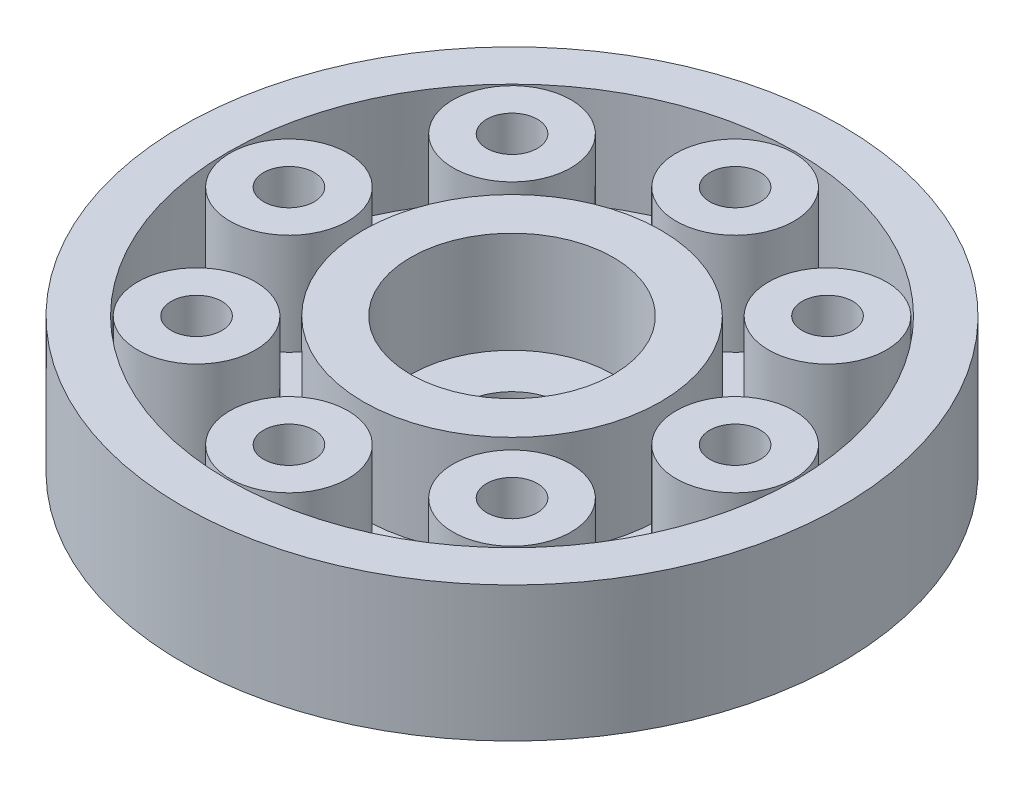
ISO-10303-21;
HEADER;
FILE_DESCRIPTION(('STEP AP214'),'2;1');
FILE_NAME('part.step','',(''),(''),'','','');
FILE_SCHEMA(('AUTOMOTIVE_DESIGN { 1 0 10303 214 1 1 1 1 }'));
ENDSEC;
DATA;
#1=APPLICATION_CONTEXT('core data for automotive mechanical design processes');
#2=APPLICATION_PROTOCOL_DEFINITION('international standard','automotive_design',2000,#1);
#3=PRODUCT_CONTEXT('',#1,'mechanical');
#4=PRODUCT('Part','Part','',(#3));
#5=PRODUCT_RELATED_PRODUCT_CATEGORY('part','',(#4));
#6=PRODUCT_DEFINITION_FORMATION('','',#4);
#7=PRODUCT_DEFINITION_CONTEXT('part definition',#1,'design');
#8=PRODUCT_DEFINITION('design','',#6,#7);
#9=PRODUCT_DEFINITION_SHAPE('','',#8);
#10=(LENGTH_UNIT() NAMED_UNIT(*) SI_UNIT(.MILLI.,.METRE.));
#11=(NAMED_UNIT(*) PLANE_ANGLE_UNIT() SI_UNIT($,.RADIAN.));
#12=(NAMED_UNIT(*) SI_UNIT($,.STERADIAN.) SOLID_ANGLE_UNIT());
#13=UNCERTAINTY_MEASURE_WITH_UNIT(LENGTH_MEASURE(1.E-05),#10,'distance_accuracy_value','');
#14=(GEOMETRIC_REPRESENTATION_CONTEXT(3) GLOBAL_UNCERTAINTY_ASSIGNED_CONTEXT((#13)) GLOBAL_UNIT_ASSIGNED_CONTEXT((#10,
#11,#12)) REPRESENTATION_CONTEXT('',''));
#15=CARTESIAN_POINT('',(0.,0.,0.));
#16=DIRECTION('',(0.,0.,1.));
#17=DIRECTION('',(1.,0.,0.));
#18=AXIS2_PLACEMENT_3D('',#15,#16,#17);
#19=CARTESIAN_POINT('',(0.394660743405106,3.,0.591991115107673));
#20=DIRECTION('',(0.,1.,0.));
#21=DIRECTION('',(0.,0.,1.));
#22=AXIS2_PLACEMENT_3D('',#19,#20,#21);
#23=PLANE('',#22);
#24=CARTESIAN_POINT('',(0.394660743405106,3.,0.591991115107673));
#25=DIRECTION('',(0.,1.,0.));
#26=DIRECTION('',(0.,0.,1.));
#27=AXIS2_PLACEMENT_3D('',#24,#25,#26);
#28=CIRCLE('',#27,4.4);
#29=CARTESIAN_POINT('',(0.394660743405106,3.,4.99199111510767));
#30=VERTEX_POINT('',#29);
#31=EDGE_CURVE('E52',#30,#30,#28,.T.);
#32=ORIENTED_EDGE('',*,*,#31,.T.);
#33=EDGE_LOOP('',(#32));
#34=FACE_BOUND('',#33,.T.);
#35=CARTESIAN_POINT('',(0.394660743405106,3.,0.591991115107673));
#36=DIRECTION('',(0.,1.,0.));
#37=DIRECTION('',(0.,0.,1.));
#38=AXIS2_PLACEMENT_3D('',#35,#36,#37);
#39=CIRCLE('',#38,3.);
#40=CARTESIAN_POINT('',(0.394660743405106,3.,3.59199111510767));
#41=VERTEX_POINT('',#40);
#42=EDGE_CURVE('E97',#41,#41,#39,.T.);
#43=ORIENTED_EDGE('',*,*,#42,.F.);
#44=EDGE_LOOP('',(#43));
#45=FACE_BOUND('',#44,.T.);
#46=ADVANCED_FACE('F36',(#34,#45),#23,.T.);
#47=CARTESIAN_POINT('',(0.394660743405106,3.,0.591991115107673));
#48=DIRECTION('',(0.,1.,0.));
#49=DIRECTION('',(0.,0.,1.));
#50=AXIS2_PLACEMENT_3D('',#47,#48,#49);
#51=CIRCLE('',#50,8.4);
#52=CARTESIAN_POINT('',(0.394660743405106,3.,8.99199111510768));
#53=VERTEX_POINT('',#52);
#54=EDGE_CURVE('E40',#53,#53,#51,.T.);
#55=ORIENTED_EDGE('',*,*,#54,.F.);
#56=EDGE_LOOP('',(#55));
#57=FACE_BOUND('',#56,.T.);
#58=CARTESIAN_POINT('',(0.394660743405106,3.,0.591991115107673));
#59=DIRECTION('',(0.,1.,0.));
#60=DIRECTION('',(0.,0.,1.));
#61=AXIS2_PLACEMENT_3D('',#58,#59,#60);
#62=CIRCLE('',#61,9.75);
#63=CARTESIAN_POINT('',(0.394660743405106,3.,10.3419911151077));
#64=VERTEX_POINT('',#63);
#65=EDGE_CURVE('E10',#64,#64,#62,.T.);
#66=ORIENTED_EDGE('',*,*,#65,.T.);
#67=EDGE_LOOP('',(#66));
#68=FACE_BOUND('',#67,.T.);
#69=ADVANCED_FACE('F86',(#57,#68),#23,.T.);
#70=CARTESIAN_POINT('',(0.394660743405106,3.,0.591991115107673));
#71=DIRECTION('',(0.,-1.,0.));
#72=DIRECTION('',(0.,0.,-1.));
#73=AXIS2_PLACEMENT_3D('',#70,#71,#72);
#74=CYLINDRICAL_SURFACE('',#73,9.75);
#75=ORIENTED_EDGE('',*,*,#65,.F.);
#76=EDGE_LOOP('',(#75));
#77=FACE_BOUND('',#76,.T.);
#78=CARTESIAN_POINT('',(0.394660743405106,-1.,0.591991115107673));
#79=DIRECTION('',(0.,-1.,0.));
#80=DIRECTION('',(0.,0.,-1.));
#81=AXIS2_PLACEMENT_3D('',#78,#79,#80);
#82=CIRCLE('',#81,9.75);
#83=CARTESIAN_POINT('',(0.394660743405106,-1.,-9.15800888489233));
#84=VERTEX_POINT('',#83);
#85=EDGE_CURVE('E44',#84,#84,#82,.T.);
#86=ORIENTED_EDGE('',*,*,#85,.F.);
#87=EDGE_LOOP('',(#86));
#88=FACE_BOUND('',#87,.T.);
#89=ADVANCED_FACE('F38',(#77,#88),#74,.T.);
#90=CARTESIAN_POINT('',(0.394660743405106,0.,0.591991115107673));
#91=DIRECTION('',(0.,-1.,0.));
#92=DIRECTION('',(0.,0.,-1.));
#93=AXIS2_PLACEMENT_3D('',#90,#91,#92);
#94=PLANE('',#93);
#95=CARTESIAN_POINT('',(0.394660743405106,0.,0.591991115107673));
#96=DIRECTION('',(0.,1.,0.));
#97=DIRECTION('',(0.,0.,1.));
#98=AXIS2_PLACEMENT_3D('',#95,#96,#97);
#99=CIRCLE('',#98,3.);
#100=CARTESIAN_POINT('',(0.394660743405106,0.,3.59199111510767));
#101=VERTEX_POINT('',#100);
#102=EDGE_CURVE('E100',#101,#101,#99,.T.);
#103=ORIENTED_EDGE('',*,*,#102,.T.);
#104=EDGE_LOOP('',(#103));
#105=FACE_BOUND('',#104,.T.);
#106=CARTESIAN_POINT('',(0.394660743405106,0.,0.591991115107673));
#107=DIRECTION('',(0.,1.,0.));
#108=DIRECTION('',(0.,0.,1.));
#109=AXIS2_PLACEMENT_3D('',#106,#107,#108);
#110=CIRCLE('',#109,1.5);
#111=CARTESIAN_POINT('',(0.394660743405106,0.,2.09199111510767));
#112=VERTEX_POINT('',#111);
#113=EDGE_CURVE('E58',#112,#112,#110,.T.);
#114=ORIENTED_EDGE('',*,*,#113,.F.);
#115=EDGE_LOOP('',(#114));
#116=FACE_BOUND('',#115,.T.);
#117=ADVANCED_FACE('F75',(#105,#116),#94,.F.);
#118=CARTESIAN_POINT('',(0.394660743405106,-1.,0.591991115107673));
#119=DIRECTION('',(0.,-1.,0.));
#120=DIRECTION('',(0.,0.,-1.));
#121=AXIS2_PLACEMENT_3D('',#118,#119,#120);
#122=PLANE('',#121);
#123=CARTESIAN_POINT('',(5.06156549923621,-1.,-4.07491364072347));
#124=DIRECTION('',(0.,-1.,0.));
#125=DIRECTION('',(0.,0.,-1.));
#126=AXIS2_PLACEMENT_3D('',#123,#124,#125);
#127=CIRCLE('',#126,0.749999999999999);
#128=CARTESIAN_POINT('',(5.06156549923621,-1.,-4.82491364072347));
#129=VERTEX_POINT('',#128);
#130=EDGE_CURVE('E99',#129,#129,#127,.T.);
#131=ORIENTED_EDGE('',*,*,#130,.F.);
#132=EDGE_LOOP('',(#131));
#133=FACE_BOUND('',#132,.T.);
#134=CARTESIAN_POINT('',(6.99466074340492,-1.,0.591991115107791));
#135=DIRECTION('',(0.,-1.,0.));
#136=DIRECTION('',(0.,0.,-1.));
#137=AXIS2_PLACEMENT_3D('',#134,#135,#136);
#138=CIRCLE('',#137,0.75);
#139=CARTESIAN_POINT('',(6.99466074340492,-1.,-0.158008884892209));
#140=VERTEX_POINT('',#139);
#141=EDGE_CURVE('E103',#140,#140,#138,.T.);
#142=ORIENTED_EDGE('',*,*,#141,.F.);
#143=EDGE_LOOP('',(#142));
#144=FACE_BOUND('',#143,.T.);
#145=CARTESIAN_POINT('',(5.06156549923604,-1.,5.25889587093898));
#146=DIRECTION('',(0.,-1.,0.));
#147=DIRECTION('',(0.,0.,-1.));
#148=AXIS2_PLACEMENT_3D('',#145,#146,#147);
#149=CIRCLE('',#148,0.75);
#150=CARTESIAN_POINT('',(5.06156549923604,-1.,4.50889587093898));
#151=VERTEX_POINT('',#150);
#152=EDGE_CURVE('E109',#151,#151,#149,.T.);
#153=ORIENTED_EDGE('',*,*,#152,.F.);
#154=EDGE_LOOP('',(#153));
#155=FACE_BOUND('',#154,.T.);
#156=CARTESIAN_POINT('',(0.39466074340478,-1.,7.19199111510767));
#157=DIRECTION('',(0.,-1.,0.));
#158=DIRECTION('',(0.,0.,-1.));
#159=AXIS2_PLACEMENT_3D('',#156,#157,#158);
#160=CIRCLE('',#159,0.75);
#161=CARTESIAN_POINT('',(0.39466074340478,-1.,6.44199111510767));
#162=VERTEX_POINT('',#161);
#163=EDGE_CURVE('E112',#162,#162,#160,.T.);
#164=ORIENTED_EDGE('',*,*,#163,.F.);
#165=EDGE_LOOP('',(#164));
#166=FACE_BOUND('',#165,.T.);
#167=CARTESIAN_POINT('',(-4.2722440124264,-1.,5.25889587093878));
#168=DIRECTION('',(0.,-1.,0.));
#169=DIRECTION('',(0.,0.,-1.));
#170=AXIS2_PLACEMENT_3D('',#167,#168,#169);
#171=CIRCLE('',#170,0.75);
#172=CARTESIAN_POINT('',(-4.2722440124264,-1.,4.50889587093878));
#173=VERTEX_POINT('',#172);
#174=EDGE_CURVE('E115',#173,#173,#171,.T.);
#175=ORIENTED_EDGE('',*,*,#174,.F.);
#176=EDGE_LOOP('',(#175));
#177=FACE_BOUND('',#176,.T.);
#178=CARTESIAN_POINT('',(-6.20533925659508,-1.,0.59199111510751));
#179=DIRECTION('',(0.,-1.,0.));
#180=DIRECTION('',(0.,0.,-1.));
#181=AXIS2_PLACEMENT_3D('',#178,#179,#180);
#182=CIRCLE('',#181,0.75);
#183=CARTESIAN_POINT('',(-6.20533925659508,-1.,-0.15800888489249));
#184=VERTEX_POINT('',#183);
#185=EDGE_CURVE('E118',#184,#184,#182,.T.);
#186=ORIENTED_EDGE('',*,*,#185,.F.);
#187=EDGE_LOOP('',(#186));
#188=FACE_BOUND('',#187,.T.);
#189=CARTESIAN_POINT('',(-4.27224401242617,-1.,-4.07491364072366));
#190=DIRECTION('',(0.,-1.,0.));
#191=DIRECTION('',(0.,0.,-1.));
#192=AXIS2_PLACEMENT_3D('',#189,#190,#191);
#193=CIRCLE('',#192,0.749999999999999);
#194=CARTESIAN_POINT('',(-4.27224401242617,-1.,-4.82491364072366));
#195=VERTEX_POINT('',#194);
#196=EDGE_CURVE('E121',#195,#195,#193,.T.);
#197=ORIENTED_EDGE('',*,*,#196,.F.);
#198=EDGE_LOOP('',(#197));
#199=FACE_BOUND('',#198,.T.);
#200=CARTESIAN_POINT('',(0.394660743405106,-1.,-6.00800888489233));
#201=DIRECTION('',(0.,-1.,0.));
#202=DIRECTION('',(0.,0.,-1.));
#203=AXIS2_PLACEMENT_3D('',#200,#201,#202);
#204=CIRCLE('',#203,0.75);
#205=CARTESIAN_POINT('',(0.394660743405106,-1.,-6.75800888489233));
#206=VERTEX_POINT('',#205);
#207=EDGE_CURVE('E124',#206,#206,#204,.T.);
#208=ORIENTED_EDGE('',*,*,#207,.F.);
#209=EDGE_LOOP('',(#208));
#210=FACE_BOUND('',#209,.T.);
#211=CARTESIAN_POINT('',(0.394660743405106,-1.,0.591991115107673));
#212=DIRECTION('',(0.,1.,0.));
#213=DIRECTION('',(0.,0.,1.));
#214=AXIS2_PLACEMENT_3D('',#211,#212,#213);
#215=CIRCLE('',#214,1.5);
#216=CARTESIAN_POINT('',(0.394660743405106,-1.,2.09199111510767));
#217=VERTEX_POINT('',#216);
#218=EDGE_CURVE('E49',#217,#217,#215,.T.);
#219=ORIENTED_EDGE('',*,*,#218,.T.);
#220=EDGE_LOOP('',(#219));
#221=FACE_BOUND('',#220,.T.);
#222=ORIENTED_EDGE('',*,*,#85,.T.);
#223=EDGE_LOOP('',(#222));
#224=FACE_BOUND('',#223,.T.);
#225=ADVANCED_FACE('F77',(#133,#144,#155,#166,#177,#188,#199,#210,#221,#224),#122,.T.);
#226=CARTESIAN_POINT('',(0.394660743405106,-1.,0.591991115107673));
#227=DIRECTION('',(0.,1.,0.));
#228=DIRECTION('',(0.,0.,1.));
#229=AXIS2_PLACEMENT_3D('',#226,#227,#228);
#230=CYLINDRICAL_SURFACE('',#229,1.5);
#231=ORIENTED_EDGE('',*,*,#218,.F.);
#232=EDGE_LOOP('',(#231));
#233=FACE_BOUND('',#232,.T.);
#234=ORIENTED_EDGE('',*,*,#113,.T.);
#235=EDGE_LOOP('',(#234));
#236=FACE_BOUND('',#235,.T.);
#237=ADVANCED_FACE('F73',(#233,#236),#230,.F.);
#238=CARTESIAN_POINT('',(0.394660743405106,10.,0.591991115107673));
#239=DIRECTION('',(0.,-1.,0.));
#240=DIRECTION('',(0.,0.,-1.));
#241=AXIS2_PLACEMENT_3D('',#238,#239,#240);
#242=CYLINDRICAL_SURFACE('',#241,8.4);
#243=ORIENTED_EDGE('',*,*,#54,.T.);
#244=EDGE_LOOP('',(#243));
#245=FACE_BOUND('',#244,.T.);
#246=CARTESIAN_POINT('',(0.394660743405106,0.,0.591991115107673));
#247=DIRECTION('',(0.,-1.,0.));
#248=DIRECTION('',(0.,0.,-1.));
#249=AXIS2_PLACEMENT_3D('',#246,#247,#248);
#250=CIRCLE('',#249,8.4);
#251=CARTESIAN_POINT('',(0.394660743405106,0.,-7.80800888489233));
#252=VERTEX_POINT('',#251);
#253=EDGE_CURVE('E54',#252,#252,#250,.T.);
#254=ORIENTED_EDGE('',*,*,#253,.T.);
#255=EDGE_LOOP('',(#254));
#256=FACE_BOUND('',#255,.T.);
#257=ADVANCED_FACE('F220',(#245,#256),#242,.F.);
#258=CARTESIAN_POINT('',(0.394660743405106,0.,0.591991115107673));
#259=DIRECTION('',(0.,-1.,0.));
#260=DIRECTION('',(0.,0.,-1.));
#261=AXIS2_PLACEMENT_3D('',#258,#259,#260);
#262=PLANE('',#261);
#263=CARTESIAN_POINT('',(5.06156549923621,0.,-4.07491364072347));
#264=DIRECTION('',(0.,-1.,0.));
#265=DIRECTION('',(0.,0.,-1.));
#266=AXIS2_PLACEMENT_3D('',#263,#264,#265);
#267=CIRCLE('',#266,1.7444823620493);
#268=CARTESIAN_POINT('',(5.06156549923621,0.,-5.81939600277277));
#269=VERTEX_POINT('',#268);
#270=EDGE_CURVE('E130',#269,#269,#267,.T.);
#271=ORIENTED_EDGE('',*,*,#270,.T.);
#272=EDGE_LOOP('',(#271));
#273=FACE_BOUND('',#272,.T.);
#274=CARTESIAN_POINT('',(6.99466074340492,0.,0.591991115107791));
#275=DIRECTION('',(0.,-1.,0.));
#276=DIRECTION('',(0.,0.,-1.));
#277=AXIS2_PLACEMENT_3D('',#274,#275,#276);
#278=CIRCLE('',#277,1.7444823620493);
#279=CARTESIAN_POINT('',(6.99466074340492,0.,-1.15249124694151));
#280=VERTEX_POINT('',#279);
#281=EDGE_CURVE('E139',#280,#280,#278,.T.);
#282=ORIENTED_EDGE('',*,*,#281,.T.);
#283=EDGE_LOOP('',(#282));
#284=FACE_BOUND('',#283,.T.);
#285=CARTESIAN_POINT('',(5.06156549923604,0.,5.25889587093898));
#286=DIRECTION('',(0.,-1.,0.));
#287=DIRECTION('',(0.,0.,-1.));
#288=AXIS2_PLACEMENT_3D('',#285,#286,#287);
#289=CIRCLE('',#288,1.7444823620493);
#290=CARTESIAN_POINT('',(5.06156549923604,0.,3.51441350888968));
#291=VERTEX_POINT('',#290);
#292=EDGE_CURVE('E148',#291,#291,#289,.T.);
#293=ORIENTED_EDGE('',*,*,#292,.T.);
#294=EDGE_LOOP('',(#293));
#295=FACE_BOUND('',#294,.T.);
#296=CARTESIAN_POINT('',(0.39466074340478,0.,7.19199111510767));
#297=DIRECTION('',(0.,-1.,0.));
#298=DIRECTION('',(0.,0.,-1.));
#299=AXIS2_PLACEMENT_3D('',#296,#297,#298);
#300=CIRCLE('',#299,1.7444823620493);
#301=CARTESIAN_POINT('',(0.39466074340478,0.,5.44750875305837));
#302=VERTEX_POINT('',#301);
#303=EDGE_CURVE('E157',#302,#302,#300,.T.);
#304=ORIENTED_EDGE('',*,*,#303,.T.);
#305=EDGE_LOOP('',(#304));
#306=FACE_BOUND('',#305,.T.);
#307=CARTESIAN_POINT('',(-4.2722440124264,0.,5.25889587093878));
#308=DIRECTION('',(0.,-1.,0.));
#309=DIRECTION('',(0.,0.,-1.));
#310=AXIS2_PLACEMENT_3D('',#307,#308,#309);
#311=CIRCLE('',#310,1.7444823620493);
#312=CARTESIAN_POINT('',(-4.2722440124264,0.,3.51441350888948));
#313=VERTEX_POINT('',#312);
#314=EDGE_CURVE('E166',#313,#313,#311,.T.);
#315=ORIENTED_EDGE('',*,*,#314,.T.);
#316=EDGE_LOOP('',(#315));
#317=FACE_BOUND('',#316,.T.);
#318=CARTESIAN_POINT('',(-6.20533925659508,0.,0.59199111510751));
#319=DIRECTION('',(0.,-1.,0.));
#320=DIRECTION('',(0.,0.,-1.));
#321=AXIS2_PLACEMENT_3D('',#318,#319,#320);
#322=CIRCLE('',#321,1.7444823620493);
#323=CARTESIAN_POINT('',(-6.20533925659508,0.,-1.15249124694179));
#324=VERTEX_POINT('',#323);
#325=EDGE_CURVE('E175',#324,#324,#322,.T.);
#326=ORIENTED_EDGE('',*,*,#325,.T.);
#327=EDGE_LOOP('',(#326));
#328=FACE_BOUND('',#327,.T.);
#329=CARTESIAN_POINT('',(-4.27224401242617,0.,-4.07491364072366));
#330=DIRECTION('',(0.,-1.,0.));
#331=DIRECTION('',(0.,0.,-1.));
#332=AXIS2_PLACEMENT_3D('',#329,#330,#331);
#333=CIRCLE('',#332,1.7444823620493);
#334=CARTESIAN_POINT('',(-4.27224401242617,0.,-5.81939600277296));
#335=VERTEX_POINT('',#334);
#336=EDGE_CURVE('E184',#335,#335,#333,.T.);
#337=ORIENTED_EDGE('',*,*,#336,.T.);
#338=EDGE_LOOP('',(#337));
#339=FACE_BOUND('',#338,.T.);
#340=CARTESIAN_POINT('',(0.394660743405106,0.,-6.00800888489233));
#341=DIRECTION('',(0.,-1.,0.));
#342=DIRECTION('',(0.,0.,-1.));
#343=AXIS2_PLACEMENT_3D('',#340,#341,#342);
#344=CIRCLE('',#343,1.7444823620493);
#345=CARTESIAN_POINT('',(0.394660743405106,0.,-7.75249124694163));
#346=VERTEX_POINT('',#345);
#347=EDGE_CURVE('E193',#346,#346,#344,.T.);
#348=ORIENTED_EDGE('',*,*,#347,.T.);
#349=EDGE_LOOP('',(#348));
#350=FACE_BOUND('',#349,.T.);
#351=CARTESIAN_POINT('',(0.394660743405106,0.,0.591991115107673));
#352=DIRECTION('',(0.,-1.,0.));
#353=DIRECTION('',(0.,0.,-1.));
#354=AXIS2_PLACEMENT_3D('',#351,#352,#353);
#355=CIRCLE('',#354,4.4);
#356=CARTESIAN_POINT('',(0.394660743405106,0.,-3.80800888489233));
#357=VERTEX_POINT('',#356);
#358=EDGE_CURVE('E60',#357,#357,#355,.T.);
#359=ORIENTED_EDGE('',*,*,#358,.T.);
#360=EDGE_LOOP('',(#359));
#361=FACE_BOUND('',#360,.T.);
#362=ORIENTED_EDGE('',*,*,#253,.F.);
#363=EDGE_LOOP('',(#362));
#364=FACE_BOUND('',#363,.T.);
#365=ADVANCED_FACE('F198',(#273,#284,#295,#306,#317,#328,#339,#350,#361,#364),#262,.F.);
#366=CARTESIAN_POINT('',(0.394660743405106,10.,0.591991115107673));
#367=DIRECTION('',(0.,-1.,0.));
#368=DIRECTION('',(0.,0.,-1.));
#369=AXIS2_PLACEMENT_3D('',#366,#367,#368);
#370=CYLINDRICAL_SURFACE('',#369,4.4);
#371=ORIENTED_EDGE('',*,*,#31,.F.);
#372=EDGE_LOOP('',(#371));
#373=FACE_BOUND('',#372,.T.);
#374=ORIENTED_EDGE('',*,*,#358,.F.);
#375=EDGE_LOOP('',(#374));
#376=FACE_BOUND('',#375,.T.);
#377=ADVANCED_FACE('F204',(#373,#376),#370,.T.);
#378=CARTESIAN_POINT('',(0.394660743405106,3.,-6.00800888489233));
#379=DIRECTION('',(0.,-1.,0.));
#380=DIRECTION('',(0.,0.,-1.));
#381=AXIS2_PLACEMENT_3D('',#378,#379,#380);
#382=CYLINDRICAL_SURFACE('',#381,1.7444823620493);
#383=CARTESIAN_POINT('',(0.394660743405106,3.,-6.00800888489233));
#384=DIRECTION('',(0.,-1.,0.));
#385=DIRECTION('',(0.,0.,-1.));
#386=AXIS2_PLACEMENT_3D('',#383,#384,#385);
#387=CIRCLE('',#386,1.7444823620493);
#388=CARTESIAN_POINT('',(0.394660743405106,3.,-7.75249124694163));
#389=VERTEX_POINT('',#388);
#390=EDGE_CURVE('E65',#389,#389,#387,.T.);
#391=ORIENTED_EDGE('',*,*,#390,.T.);
#392=EDGE_LOOP('',(#391));
#393=FACE_BOUND('',#392,.T.);
#394=ORIENTED_EDGE('',*,*,#347,.F.);
#395=EDGE_LOOP('',(#394));
#396=FACE_BOUND('',#395,.T.);
#397=ADVANCED_FACE('F201',(#393,#396),#382,.T.);
#398=CARTESIAN_POINT('',(0.394660743405106,3.,-6.00800888489233));
#399=DIRECTION('',(0.,-1.,0.));
#400=DIRECTION('',(0.,0.,-1.));
#401=AXIS2_PLACEMENT_3D('',#398,#399,#400);
#402=PLANE('',#401);
#403=CARTESIAN_POINT('',(0.394660743405106,3.,-6.00800888489233));
#404=DIRECTION('',(0.,-1.,0.));
#405=DIRECTION('',(0.,0.,-1.));
#406=AXIS2_PLACEMENT_3D('',#403,#404,#405);
#407=CIRCLE('',#406,0.75);
#408=CARTESIAN_POINT('',(0.394660743405106,3.,-6.75800888489233));
#409=VERTEX_POINT('',#408);
#410=EDGE_CURVE('E188',#409,#409,#407,.T.);
#411=ORIENTED_EDGE('',*,*,#410,.T.);
#412=EDGE_LOOP('',(#411));
#413=FACE_BOUND('',#412,.T.);
#414=ORIENTED_EDGE('',*,*,#390,.F.);
#415=EDGE_LOOP('',(#414));
#416=FACE_BOUND('',#415,.T.);
#417=ADVANCED_FACE('F203',(#413,#416),#402,.F.);
#418=CARTESIAN_POINT('',(0.394660743405106,3.,-6.00800888489233));
#419=DIRECTION('',(0.,-1.,0.));
#420=DIRECTION('',(0.,0.,-1.));
#421=AXIS2_PLACEMENT_3D('',#418,#419,#420);
#422=CYLINDRICAL_SURFACE('',#421,0.75);
#423=ORIENTED_EDGE('',*,*,#207,.T.);
#424=EDGE_LOOP('',(#423));
#425=FACE_BOUND('',#424,.T.);
#426=ORIENTED_EDGE('',*,*,#410,.F.);
#427=EDGE_LOOP('',(#426));
#428=FACE_BOUND('',#427,.T.);
#429=ADVANCED_FACE('F211',(#425,#428),#422,.F.);
#430=CARTESIAN_POINT('',(-4.27224401242617,3.,-4.07491364072366));
#431=DIRECTION('',(0.,-1.,0.));
#432=DIRECTION('',(0.,0.,-1.));
#433=AXIS2_PLACEMENT_3D('',#430,#431,#432);
#434=CYLINDRICAL_SURFACE('',#433,1.7444823620493);
#435=CARTESIAN_POINT('',(-4.27224401242617,3.,-4.07491364072366));
#436=DIRECTION('',(0.,-1.,0.));
#437=DIRECTION('',(0.,0.,-1.));
#438=AXIS2_PLACEMENT_3D('',#435,#436,#437);
#439=CIRCLE('',#438,1.7444823620493);
#440=CARTESIAN_POINT('',(-4.27224401242617,3.,-5.81939600277296));
#441=VERTEX_POINT('',#440);
#442=EDGE_CURVE('E185',#441,#441,#439,.T.);
#443=ORIENTED_EDGE('',*,*,#442,.T.);
#444=EDGE_LOOP('',(#443));
#445=FACE_BOUND('',#444,.T.);
#446=ORIENTED_EDGE('',*,*,#336,.F.);
#447=EDGE_LOOP('',(#446));
#448=FACE_BOUND('',#447,.T.);
#449=ADVANCED_FACE('F272',(#445,#448),#434,.T.);
#450=CARTESIAN_POINT('',(-4.27224401242617,3.,-4.07491364072366));
#451=DIRECTION('',(0.,-1.,0.));
#452=DIRECTION('',(0.,0.,-1.));
#453=AXIS2_PLACEMENT_3D('',#450,#451,#452);
#454=PLANE('',#453);
#455=CARTESIAN_POINT('',(-4.27224401242616,3.,-4.07491364072367));
#456=DIRECTION('',(0.,-1.,0.));
#457=DIRECTION('',(0.,0.,-1.));
#458=AXIS2_PLACEMENT_3D('',#455,#456,#457);
#459=CIRCLE('',#458,0.750000000000001);
#460=CARTESIAN_POINT('',(-4.27224401242616,3.,-4.82491364072368));
#461=VERTEX_POINT('',#460);
#462=EDGE_CURVE('E179',#461,#461,#459,.T.);
#463=ORIENTED_EDGE('',*,*,#462,.T.);
#464=EDGE_LOOP('',(#463));
#465=FACE_BOUND('',#464,.T.);
#466=ORIENTED_EDGE('',*,*,#442,.F.);
#467=EDGE_LOOP('',(#466));
#468=FACE_BOUND('',#467,.T.);
#469=ADVANCED_FACE('F283',(#465,#468),#454,.F.);
#470=CARTESIAN_POINT('',(-4.27224401242616,3.,-4.07491364072367));
#471=DIRECTION('',(0.,-1.,0.));
#472=DIRECTION('',(0.,0.,-1.));
#473=AXIS2_PLACEMENT_3D('',#470,#471,#472);
#474=CYLINDRICAL_SURFACE('',#473,0.750000000000001);
#475=ORIENTED_EDGE('',*,*,#196,.T.);
#476=EDGE_LOOP('',(#475));
#477=FACE_BOUND('',#476,.T.);
#478=ORIENTED_EDGE('',*,*,#462,.F.);
#479=EDGE_LOOP('',(#478));
#480=FACE_BOUND('',#479,.T.);
#481=ADVANCED_FACE('F292',(#477,#480),#474,.F.);
#482=CARTESIAN_POINT('',(-6.20533925659508,3.,0.59199111510751));
#483=DIRECTION('',(0.,-1.,0.));
#484=DIRECTION('',(0.,0.,-1.));
#485=AXIS2_PLACEMENT_3D('',#482,#483,#484);
#486=CYLINDRICAL_SURFACE('',#485,1.7444823620493);
#487=CARTESIAN_POINT('',(-6.20533925659508,3.,0.59199111510751));
#488=DIRECTION('',(0.,-1.,0.));
#489=DIRECTION('',(0.,0.,-1.));
#490=AXIS2_PLACEMENT_3D('',#487,#488,#489);
#491=CIRCLE('',#490,1.7444823620493);
#492=CARTESIAN_POINT('',(-6.20533925659508,3.,-1.15249124694179));
#493=VERTEX_POINT('',#492);
#494=EDGE_CURVE('E176',#493,#493,#491,.T.);
#495=ORIENTED_EDGE('',*,*,#494,.T.);
#496=EDGE_LOOP('',(#495));
#497=FACE_BOUND('',#496,.T.);
#498=ORIENTED_EDGE('',*,*,#325,.F.);
#499=EDGE_LOOP('',(#498));
#500=FACE_BOUND('',#499,.T.);
#501=ADVANCED_FACE('F301',(#497,#500),#486,.T.);
#502=CARTESIAN_POINT('',(-6.20533925659508,3.,0.59199111510751));
#503=DIRECTION('',(0.,-1.,0.));
#504=DIRECTION('',(0.,0.,-1.));
#505=AXIS2_PLACEMENT_3D('',#502,#503,#504);
#506=PLANE('',#505);
#507=CARTESIAN_POINT('',(-6.20533925659508,3.,0.591991115107482));
#508=DIRECTION('',(0.,-1.,0.));
#509=DIRECTION('',(0.,0.,-1.));
#510=AXIS2_PLACEMENT_3D('',#507,#508,#509);
#511=CIRCLE('',#510,0.75);
#512=CARTESIAN_POINT('',(-6.20533925659508,3.,-0.158008884892518));
#513=VERTEX_POINT('',#512);
#514=EDGE_CURVE('E170',#513,#513,#511,.T.);
#515=ORIENTED_EDGE('',*,*,#514,.T.);
#516=EDGE_LOOP('',(#515));
#517=FACE_BOUND('',#516,.T.);
#518=ORIENTED_EDGE('',*,*,#494,.F.);
#519=EDGE_LOOP('',(#518));
#520=FACE_BOUND('',#519,.T.);
#521=ADVANCED_FACE('F312',(#517,#520),#506,.F.);
#522=CARTESIAN_POINT('',(-6.20533925659508,3.,0.591991115107482));
#523=DIRECTION('',(0.,-1.,0.));
#524=DIRECTION('',(0.,0.,-1.));
#525=AXIS2_PLACEMENT_3D('',#522,#523,#524);
#526=CYLINDRICAL_SURFACE('',#525,0.75);
#527=ORIENTED_EDGE('',*,*,#185,.T.);
#528=EDGE_LOOP('',(#527));
#529=FACE_BOUND('',#528,.T.);
#530=ORIENTED_EDGE('',*,*,#514,.F.);
#531=EDGE_LOOP('',(#530));
#532=FACE_BOUND('',#531,.T.);
#533=ADVANCED_FACE('F321',(#529,#532),#526,.F.);
#534=CARTESIAN_POINT('',(-4.2722440124264,3.,5.25889587093878));
#535=DIRECTION('',(0.,-1.,0.));
#536=DIRECTION('',(0.,0.,-1.));
#537=AXIS2_PLACEMENT_3D('',#534,#535,#536);
#538=CYLINDRICAL_SURFACE('',#537,1.7444823620493);
#539=CARTESIAN_POINT('',(-4.2722440124264,3.,5.25889587093878));
#540=DIRECTION('',(0.,-1.,0.));
#541=DIRECTION('',(0.,0.,-1.));
#542=AXIS2_PLACEMENT_3D('',#539,#540,#541);
#543=CIRCLE('',#542,1.7444823620493);
#544=CARTESIAN_POINT('',(-4.2722440124264,3.,3.51441350888948));
#545=VERTEX_POINT('',#544);
#546=EDGE_CURVE('E167',#545,#545,#543,.T.);
#547=ORIENTED_EDGE('',*,*,#546,.T.);
#548=EDGE_LOOP('',(#547));
#549=FACE_BOUND('',#548,.T.);
#550=ORIENTED_EDGE('',*,*,#314,.F.);
#551=EDGE_LOOP('',(#550));
#552=FACE_BOUND('',#551,.T.);
#553=ADVANCED_FACE('F330',(#549,#552),#538,.T.);
#554=CARTESIAN_POINT('',(-4.2722440124264,3.,5.25889587093878));
#555=DIRECTION('',(0.,-1.,0.));
#556=DIRECTION('',(0.,0.,-1.));
#557=AXIS2_PLACEMENT_3D('',#554,#555,#556);
#558=PLANE('',#557);
#559=CARTESIAN_POINT('',(-4.27224401242643,3.,5.25889587093875));
#560=DIRECTION('',(0.,-1.,0.));
#561=DIRECTION('',(0.,0.,-1.));
#562=AXIS2_PLACEMENT_3D('',#559,#560,#561);
#563=CIRCLE('',#562,0.75);
#564=CARTESIAN_POINT('',(-4.27224401242643,3.,4.50889587093875));
#565=VERTEX_POINT('',#564);
#566=EDGE_CURVE('E161',#565,#565,#563,.T.);
#567=ORIENTED_EDGE('',*,*,#566,.T.);
#568=EDGE_LOOP('',(#567));
#569=FACE_BOUND('',#568,.T.);
#570=ORIENTED_EDGE('',*,*,#546,.F.);
#571=EDGE_LOOP('',(#570));
#572=FACE_BOUND('',#571,.T.);
#573=ADVANCED_FACE('F341',(#569,#572),#558,.F.);
#574=CARTESIAN_POINT('',(-4.27224401242643,3.,5.25889587093875));
#575=DIRECTION('',(0.,-1.,0.));
#576=DIRECTION('',(0.,0.,-1.));
#577=AXIS2_PLACEMENT_3D('',#574,#575,#576);
#578=CYLINDRICAL_SURFACE('',#577,0.75);
#579=ORIENTED_EDGE('',*,*,#174,.T.);
#580=EDGE_LOOP('',(#579));
#581=FACE_BOUND('',#580,.T.);
#582=ORIENTED_EDGE('',*,*,#566,.F.);
#583=EDGE_LOOP('',(#582));
#584=FACE_BOUND('',#583,.T.);
#585=ADVANCED_FACE('F350',(#581,#584),#578,.F.);
#586=CARTESIAN_POINT('',(0.39466074340478,3.,7.19199111510767));
#587=DIRECTION('',(0.,-1.,0.));
#588=DIRECTION('',(0.,0.,-1.));
#589=AXIS2_PLACEMENT_3D('',#586,#587,#588);
#590=CYLINDRICAL_SURFACE('',#589,1.7444823620493);
#591=CARTESIAN_POINT('',(0.39466074340478,3.,7.19199111510767));
#592=DIRECTION('',(0.,-1.,0.));
#593=DIRECTION('',(0.,0.,-1.));
#594=AXIS2_PLACEMENT_3D('',#591,#592,#593);
#595=CIRCLE('',#594,1.7444823620493);
#596=CARTESIAN_POINT('',(0.39466074340478,3.,5.44750875305837));
#597=VERTEX_POINT('',#596);
#598=EDGE_CURVE('E158',#597,#597,#595,.T.);
#599=ORIENTED_EDGE('',*,*,#598,.T.);
#600=EDGE_LOOP('',(#599));
#601=FACE_BOUND('',#600,.T.);
#602=ORIENTED_EDGE('',*,*,#303,.F.);
#603=EDGE_LOOP('',(#602));
#604=FACE_BOUND('',#603,.T.);
#605=ADVANCED_FACE('F359',(#601,#604),#590,.T.);
#606=CARTESIAN_POINT('',(0.39466074340478,3.,7.19199111510767));
#607=DIRECTION('',(0.,-1.,0.));
#608=DIRECTION('',(0.,0.,-1.));
#609=AXIS2_PLACEMENT_3D('',#606,#607,#608);
#610=PLANE('',#609);
#611=CARTESIAN_POINT('',(0.394660743404724,3.,7.19199111510767));
#612=DIRECTION('',(0.,-1.,0.));
#613=DIRECTION('',(0.,0.,-1.));
#614=AXIS2_PLACEMENT_3D('',#611,#612,#613);
#615=CIRCLE('',#614,0.75);
#616=CARTESIAN_POINT('',(0.394660743404724,3.,6.44199111510767));
#617=VERTEX_POINT('',#616);
#618=EDGE_CURVE('E152',#617,#617,#615,.T.);
#619=ORIENTED_EDGE('',*,*,#618,.T.);
#620=EDGE_LOOP('',(#619));
#621=FACE_BOUND('',#620,.T.);
#622=ORIENTED_EDGE('',*,*,#598,.F.);
#623=EDGE_LOOP('',(#622));
#624=FACE_BOUND('',#623,.T.);
#625=ADVANCED_FACE('F370',(#621,#624),#610,.F.);
#626=CARTESIAN_POINT('',(0.394660743404724,3.,7.19199111510767));
#627=DIRECTION('',(0.,-1.,0.));
#628=DIRECTION('',(0.,0.,-1.));
#629=AXIS2_PLACEMENT_3D('',#626,#627,#628);
#630=CYLINDRICAL_SURFACE('',#629,0.75);
#631=ORIENTED_EDGE('',*,*,#163,.T.);
#632=EDGE_LOOP('',(#631));
#633=FACE_BOUND('',#632,.T.);
#634=ORIENTED_EDGE('',*,*,#618,.F.);
#635=EDGE_LOOP('',(#634));
#636=FACE_BOUND('',#635,.T.);
#637=ADVANCED_FACE('F379',(#633,#636),#630,.F.);
#638=CARTESIAN_POINT('',(5.06156549923604,3.,5.25889587093898));
#639=DIRECTION('',(0.,-1.,0.));
#640=DIRECTION('',(0.,0.,-1.));
#641=AXIS2_PLACEMENT_3D('',#638,#639,#640);
#642=CYLINDRICAL_SURFACE('',#641,1.7444823620493);
#643=CARTESIAN_POINT('',(5.06156549923604,3.,5.25889587093898));
#644=DIRECTION('',(0.,-1.,0.));
#645=DIRECTION('',(0.,0.,-1.));
#646=AXIS2_PLACEMENT_3D('',#643,#644,#645);
#647=CIRCLE('',#646,1.7444823620493);
#648=CARTESIAN_POINT('',(5.06156549923604,3.,3.51441350888968));
#649=VERTEX_POINT('',#648);
#650=EDGE_CURVE('E149',#649,#649,#647,.T.);
#651=ORIENTED_EDGE('',*,*,#650,.T.);
#652=EDGE_LOOP('',(#651));
#653=FACE_BOUND('',#652,.T.);
#654=ORIENTED_EDGE('',*,*,#292,.F.);
#655=EDGE_LOOP('',(#654));
#656=FACE_BOUND('',#655,.T.);
#657=ADVANCED_FACE('F388',(#653,#656),#642,.T.);
#658=CARTESIAN_POINT('',(5.06156549923604,3.,5.25889587093898));
#659=DIRECTION('',(0.,-1.,0.));
#660=DIRECTION('',(0.,0.,-1.));
#661=AXIS2_PLACEMENT_3D('',#658,#659,#660);
#662=PLANE('',#661);
#663=CARTESIAN_POINT('',(5.06156549923599,3.,5.25889587093902));
#664=DIRECTION('',(0.,-1.,0.));
#665=DIRECTION('',(0.,0.,-1.));
#666=AXIS2_PLACEMENT_3D('',#663,#664,#665);
#667=CIRCLE('',#666,0.750000000000001);
#668=CARTESIAN_POINT('',(5.06156549923599,3.,4.50889587093902));
#669=VERTEX_POINT('',#668);
#670=EDGE_CURVE('E143',#669,#669,#667,.T.);
#671=ORIENTED_EDGE('',*,*,#670,.T.);
#672=EDGE_LOOP('',(#671));
#673=FACE_BOUND('',#672,.T.);
#674=ORIENTED_EDGE('',*,*,#650,.F.);
#675=EDGE_LOOP('',(#674));
#676=FACE_BOUND('',#675,.T.);
#677=ADVANCED_FACE('F399',(#673,#676),#662,.F.);
#678=CARTESIAN_POINT('',(5.06156549923599,3.,5.25889587093902));
#679=DIRECTION('',(0.,-1.,0.));
#680=DIRECTION('',(0.,0.,-1.));
#681=AXIS2_PLACEMENT_3D('',#678,#679,#680);
#682=CYLINDRICAL_SURFACE('',#681,0.750000000000001);
#683=ORIENTED_EDGE('',*,*,#152,.T.);
#684=EDGE_LOOP('',(#683));
#685=FACE_BOUND('',#684,.T.);
#686=ORIENTED_EDGE('',*,*,#670,.F.);
#687=EDGE_LOOP('',(#686));
#688=FACE_BOUND('',#687,.T.);
#689=ADVANCED_FACE('F408',(#685,#688),#682,.F.);
#690=CARTESIAN_POINT('',(6.99466074340492,3.,0.591991115107791));
#691=DIRECTION('',(0.,-1.,0.));
#692=DIRECTION('',(0.,0.,-1.));
#693=AXIS2_PLACEMENT_3D('',#690,#691,#692);
#694=CYLINDRICAL_SURFACE('',#693,1.7444823620493);
#695=CARTESIAN_POINT('',(6.99466074340492,3.,0.591991115107791));
#696=DIRECTION('',(0.,-1.,0.));
#697=DIRECTION('',(0.,0.,-1.));
#698=AXIS2_PLACEMENT_3D('',#695,#696,#697);
#699=CIRCLE('',#698,1.7444823620493);
#700=CARTESIAN_POINT('',(6.99466074340492,3.,-1.15249124694151));
#701=VERTEX_POINT('',#700);
#702=EDGE_CURVE('E140',#701,#701,#699,.T.);
#703=ORIENTED_EDGE('',*,*,#702,.T.);
#704=EDGE_LOOP('',(#703));
#705=FACE_BOUND('',#704,.T.);
#706=ORIENTED_EDGE('',*,*,#281,.F.);
#707=EDGE_LOOP('',(#706));
#708=FACE_BOUND('',#707,.T.);
#709=ADVANCED_FACE('F417',(#705,#708),#694,.T.);
#710=CARTESIAN_POINT('',(6.99466074340492,3.,0.591991115107791));
#711=DIRECTION('',(0.,-1.,0.));
#712=DIRECTION('',(0.,0.,-1.));
#713=AXIS2_PLACEMENT_3D('',#710,#711,#712);
#714=PLANE('',#713);
#715=CARTESIAN_POINT('',(6.99466074340492,3.,0.591991115107865));
#716=DIRECTION('',(0.,-1.,0.));
#717=DIRECTION('',(0.,0.,-1.));
#718=AXIS2_PLACEMENT_3D('',#715,#716,#717);
#719=CIRCLE('',#718,0.75);
#720=CARTESIAN_POINT('',(6.99466074340492,3.,-0.158008884892135));
#721=VERTEX_POINT('',#720);
#722=EDGE_CURVE('E134',#721,#721,#719,.T.);
#723=ORIENTED_EDGE('',*,*,#722,.T.);
#724=EDGE_LOOP('',(#723));
#725=FACE_BOUND('',#724,.T.);
#726=ORIENTED_EDGE('',*,*,#702,.F.);
#727=EDGE_LOOP('',(#726));
#728=FACE_BOUND('',#727,.T.);
#729=ADVANCED_FACE('F428',(#725,#728),#714,.F.);
#730=CARTESIAN_POINT('',(6.99466074340492,3.,0.591991115107865));
#731=DIRECTION('',(0.,-1.,0.));
#732=DIRECTION('',(0.,0.,-1.));
#733=AXIS2_PLACEMENT_3D('',#730,#731,#732);
#734=CYLINDRICAL_SURFACE('',#733,0.75);
#735=ORIENTED_EDGE('',*,*,#141,.T.);
#736=EDGE_LOOP('',(#735));
#737=FACE_BOUND('',#736,.T.);
#738=ORIENTED_EDGE('',*,*,#722,.F.);
#739=EDGE_LOOP('',(#738));
#740=FACE_BOUND('',#739,.T.);
#741=ADVANCED_FACE('F437',(#737,#740),#734,.F.);
#742=CARTESIAN_POINT('',(5.06156549923621,3.,-4.07491364072347));
#743=DIRECTION('',(0.,-1.,0.));
#744=DIRECTION('',(0.,0.,-1.));
#745=AXIS2_PLACEMENT_3D('',#742,#743,#744);
#746=CYLINDRICAL_SURFACE('',#745,1.7444823620493);
#747=CARTESIAN_POINT('',(5.06156549923621,3.,-4.07491364072347));
#748=DIRECTION('',(0.,-1.,0.));
#749=DIRECTION('',(0.,0.,-1.));
#750=AXIS2_PLACEMENT_3D('',#747,#748,#749);
#751=CIRCLE('',#750,1.7444823620493);
#752=CARTESIAN_POINT('',(5.06156549923621,3.,-5.81939600277277));
#753=VERTEX_POINT('',#752);
#754=EDGE_CURVE('E131',#753,#753,#751,.T.);
#755=ORIENTED_EDGE('',*,*,#754,.T.);
#756=EDGE_LOOP('',(#755));
#757=FACE_BOUND('',#756,.T.);
#758=ORIENTED_EDGE('',*,*,#270,.F.);
#759=EDGE_LOOP('',(#758));
#760=FACE_BOUND('',#759,.T.);
#761=ADVANCED_FACE('F446',(#757,#760),#746,.T.);
#762=CARTESIAN_POINT('',(5.06156549923621,3.,-4.07491364072347));
#763=DIRECTION('',(0.,-1.,0.));
#764=DIRECTION('',(0.,0.,-1.));
#765=AXIS2_PLACEMENT_3D('',#762,#763,#764);
#766=PLANE('',#765);
#767=CARTESIAN_POINT('',(5.06156549923627,3.,-4.0749136407234));
#768=DIRECTION('',(0.,-1.,0.));
#769=DIRECTION('',(0.,0.,-1.));
#770=AXIS2_PLACEMENT_3D('',#767,#768,#769);
#771=CIRCLE('',#770,0.749999999999998);
#772=CARTESIAN_POINT('',(5.06156549923627,3.,-4.8249136407234));
#773=VERTEX_POINT('',#772);
#774=EDGE_CURVE('E127',#773,#773,#771,.T.);
#775=ORIENTED_EDGE('',*,*,#774,.T.);
#776=EDGE_LOOP('',(#775));
#777=FACE_BOUND('',#776,.T.);
#778=ORIENTED_EDGE('',*,*,#754,.F.);
#779=EDGE_LOOP('',(#778));
#780=FACE_BOUND('',#779,.T.);
#781=ADVANCED_FACE('F457',(#777,#780),#766,.F.);
#782=CARTESIAN_POINT('',(5.06156549923627,3.,-4.0749136407234));
#783=DIRECTION('',(0.,-1.,0.));
#784=DIRECTION('',(0.,0.,-1.));
#785=AXIS2_PLACEMENT_3D('',#782,#783,#784);
#786=CYLINDRICAL_SURFACE('',#785,0.749999999999998);
#787=ORIENTED_EDGE('',*,*,#130,.T.);
#788=EDGE_LOOP('',(#787));
#789=FACE_BOUND('',#788,.T.);
#790=ORIENTED_EDGE('',*,*,#774,.F.);
#791=EDGE_LOOP('',(#790));
#792=FACE_BOUND('',#791,.T.);
#793=ADVANCED_FACE('F465',(#789,#792),#786,.F.);
#794=CARTESIAN_POINT('',(0.394660743405106,3.,0.591991115107673));
#795=DIRECTION('',(0.,-1.,0.));
#796=DIRECTION('',(0.,0.,-1.));
#797=AXIS2_PLACEMENT_3D('',#794,#795,#796);
#798=CYLINDRICAL_SURFACE('',#797,3.);
#799=ORIENTED_EDGE('',*,*,#42,.T.);
#800=EDGE_LOOP('',(#799));
#801=FACE_BOUND('',#800,.T.);
#802=ORIENTED_EDGE('',*,*,#102,.F.);
#803=EDGE_LOOP('',(#802));
#804=FACE_BOUND('',#803,.T.);
#805=ADVANCED_FACE('F472',(#801,#804),#798,.F.);
#806=CLOSED_SHELL('',(#46,#69,#89,#117,#225,#237,#257,#365,#377,#397,#417,#429,#449,#469,#481,
#501,#521,#533,#553,#573,#585,#605,#625,#637,#657,#677,#689,#709,#729,#741,#761,#781,#793,#805));
#807=MANIFOLD_SOLID_BREP('B2',#806);
#808=ADVANCED_BREP_SHAPE_REPRESENTATION('',(#18,#807),#14);
#809=SHAPE_DEFINITION_REPRESENTATION(#9,#808);
ENDSEC;
END-ISO-10303-21;
